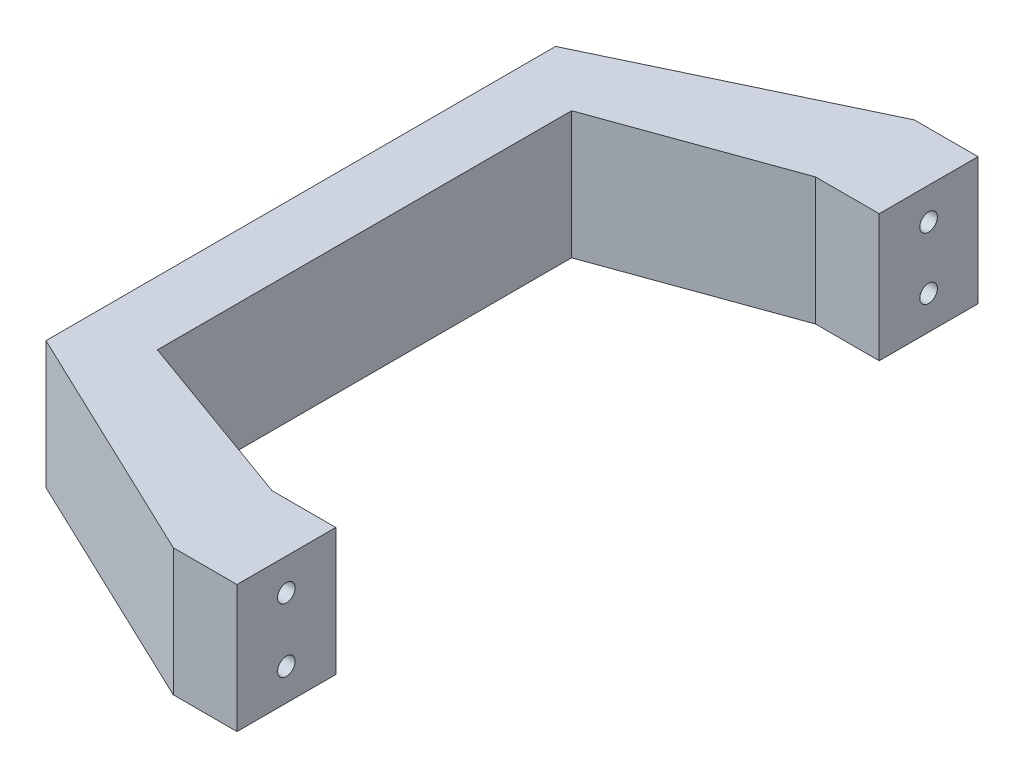
ISO-10303-21;
HEADER;
FILE_DESCRIPTION(('STEP AP214'),'2;1');
FILE_NAME('part.step','',(''),(''),'','','');
FILE_SCHEMA(('AUTOMOTIVE_DESIGN { 1 0 10303 214 1 1 1 1 }'));
ENDSEC;
DATA;
#1=APPLICATION_CONTEXT('core data for automotive mechanical design processes');
#2=APPLICATION_PROTOCOL_DEFINITION('international standard','automotive_design',2000,#1);
#3=PRODUCT_CONTEXT('',#1,'mechanical');
#4=PRODUCT('Part','Part','',(#3));
#5=PRODUCT_RELATED_PRODUCT_CATEGORY('part','',(#4));
#6=PRODUCT_DEFINITION_FORMATION('','',#4);
#7=PRODUCT_DEFINITION_CONTEXT('part definition',#1,'design');
#8=PRODUCT_DEFINITION('design','',#6,#7);
#9=PRODUCT_DEFINITION_SHAPE('','',#8);
#10=(LENGTH_UNIT() NAMED_UNIT(*) SI_UNIT(.MILLI.,.METRE.));
#11=(NAMED_UNIT(*) PLANE_ANGLE_UNIT() SI_UNIT($,.RADIAN.));
#12=(NAMED_UNIT(*) SI_UNIT($,.STERADIAN.) SOLID_ANGLE_UNIT());
#13=UNCERTAINTY_MEASURE_WITH_UNIT(LENGTH_MEASURE(1.E-05),#10,'distance_accuracy_value','');
#14=(GEOMETRIC_REPRESENTATION_CONTEXT(3) GLOBAL_UNCERTAINTY_ASSIGNED_CONTEXT((#13)) GLOBAL_UNIT_ASSIGNED_CONTEXT((#10,
#11,#12)) REPRESENTATION_CONTEXT('',''));
#15=CARTESIAN_POINT('',(0.,0.,0.));
#16=DIRECTION('',(0.,0.,1.));
#17=DIRECTION('',(1.,0.,0.));
#18=AXIS2_PLACEMENT_3D('',#15,#16,#17);
#19=CARTESIAN_POINT('',(-370.28515918275,25.4,60.7601053290348));
#20=DIRECTION('',(0.,0.,-1.));
#21=DIRECTION('',(-1.,0.,0.));
#22=AXIS2_PLACEMENT_3D('',#19,#20,#21);
#23=PLANE('',#22);
#24=DIRECTION('',(1.,0.,0.));
#25=VECTOR('',#24,1.);
#26=CARTESIAN_POINT('',(-370.28515918275,0.,60.7601053290348));
#27=LINE('',#26,#25);
#28=CARTESIAN_POINT('',(-382.98515918275,0.,60.7601053290348));
#29=VERTEX_POINT('',#28);
#30=CARTESIAN_POINT('',(-370.28515918275,0.,60.7601053290348));
#31=VERTEX_POINT('',#30);
#32=EDGE_CURVE('E156',#29,#31,#27,.T.);
#33=ORIENTED_EDGE('',*,*,#32,.T.);
#34=DIRECTION('',(0.,-1.,0.));
#35=VECTOR('',#34,1.);
#36=CARTESIAN_POINT('',(-370.28515918275,25.4,60.7601053290348));
#37=LINE('',#36,#35);
#38=CARTESIAN_POINT('',(-370.28515918275,25.4,60.7601053290348));
#39=VERTEX_POINT('',#38);
#40=EDGE_CURVE('E11',#39,#31,#37,.T.);
#41=ORIENTED_EDGE('',*,*,#40,.F.);
#42=DIRECTION('',(1.,0.,0.));
#43=VECTOR('',#42,1.);
#44=CARTESIAN_POINT('',(-370.28515918275,25.4,60.7601053290348));
#45=LINE('',#44,#43);
#46=CARTESIAN_POINT('',(-382.98515918275,25.4,60.7601053290348));
#47=VERTEX_POINT('',#46);
#48=EDGE_CURVE('E179',#47,#39,#45,.T.);
#49=ORIENTED_EDGE('',*,*,#48,.F.);
#50=DIRECTION('',(0.,-1.,0.));
#51=VECTOR('',#50,1.);
#52=CARTESIAN_POINT('',(-382.98515918275,25.4,60.7601053290348));
#53=LINE('',#52,#51);
#54=EDGE_CURVE('E152',#47,#29,#53,.T.);
#55=ORIENTED_EDGE('',*,*,#54,.T.);
#56=EDGE_LOOP('',(#33,#41,#49,#55));
#57=FACE_BOUND('',#56,.T.);
#58=ADVANCED_FACE('F36',(#57),#23,.F.);
#59=CARTESIAN_POINT('',(-370.28515918275,25.4,60.7601053290348));
#60=DIRECTION('',(-1.,0.,0.));
#61=DIRECTION('',(0.,0.,1.));
#62=AXIS2_PLACEMENT_3D('',#59,#60,#61);
#63=PLANE('',#62);
#64=CARTESIAN_POINT('',(-370.28515918275,19.05,50.912648711417));
#65=DIRECTION('',(1.,0.,0.));
#66=DIRECTION('',(0.,0.,-1.));
#67=AXIS2_PLACEMENT_3D('',#64,#65,#66);
#68=CIRCLE('',#67,1.75259999999999);
#69=CARTESIAN_POINT('',(-370.28515918275,19.05,49.160048711417));
#70=VERTEX_POINT('',#69);
#71=EDGE_CURVE('E493',#70,#70,#68,.T.);
#72=ORIENTED_EDGE('',*,*,#71,.F.);
#73=EDGE_LOOP('',(#72));
#74=FACE_BOUND('',#73,.T.);
#75=CARTESIAN_POINT('',(-370.28515918275,6.73055806956673,50.912648711417));
#76=DIRECTION('',(1.,0.,0.));
#77=DIRECTION('',(0.,0.,-1.));
#78=AXIS2_PLACEMENT_3D('',#75,#76,#77);
#79=CIRCLE('',#78,1.7526);
#80=CARTESIAN_POINT('',(-370.28515918275,6.73055806956673,49.160048711417));
#81=VERTEX_POINT('',#80);
#82=EDGE_CURVE('E515',#81,#81,#79,.T.);
#83=ORIENTED_EDGE('',*,*,#82,.F.);
#84=EDGE_LOOP('',(#83));
#85=FACE_BOUND('',#84,.T.);
#86=DIRECTION('',(0.,0.,-1.));
#87=VECTOR('',#86,1.);
#88=CARTESIAN_POINT('',(-370.28515918275,0.,60.7601053290348));
#89=LINE('',#88,#87);
#90=CARTESIAN_POINT('',(-370.28515918275,0.,41.0651920937729));
#91=VERTEX_POINT('',#90);
#92=EDGE_CURVE('E159',#31,#91,#89,.T.);
#93=ORIENTED_EDGE('',*,*,#92,.T.);
#94=DIRECTION('',(0.,-1.,0.));
#95=VECTOR('',#94,1.);
#96=CARTESIAN_POINT('',(-370.28515918275,25.4,41.0651920937729));
#97=LINE('',#96,#95);
#98=CARTESIAN_POINT('',(-370.28515918275,25.4,41.0651920937729));
#99=VERTEX_POINT('',#98);
#100=EDGE_CURVE('E44',#99,#91,#97,.T.);
#101=ORIENTED_EDGE('',*,*,#100,.F.);
#102=DIRECTION('',(0.,0.,-1.));
#103=VECTOR('',#102,1.);
#104=CARTESIAN_POINT('',(-370.28515918275,25.4,60.7601053290348));
#105=LINE('',#104,#103);
#106=EDGE_CURVE('E107',#39,#99,#105,.T.);
#107=ORIENTED_EDGE('',*,*,#106,.F.);
#108=ORIENTED_EDGE('',*,*,#40,.T.);
#109=EDGE_LOOP('',(#93,#101,#107,#108));
#110=FACE_BOUND('',#109,.T.);
#111=ADVANCED_FACE('F257',(#74,#85,#110),#63,.F.);
#112=CARTESIAN_POINT('',(-370.28515918275,25.4,41.0651920937729));
#113=DIRECTION('',(0.,0.,1.));
#114=DIRECTION('',(1.,0.,0.));
#115=AXIS2_PLACEMENT_3D('',#112,#113,#114);
#116=PLANE('',#115);
#117=DIRECTION('',(-1.,0.,0.));
#118=VECTOR('',#117,1.);
#119=CARTESIAN_POINT('',(-370.28515918275,0.,41.0651920937729));
#120=LINE('',#119,#118);
#121=CARTESIAN_POINT('',(-382.98515918275,0.,41.0651920937729));
#122=VERTEX_POINT('',#121);
#123=EDGE_CURVE('E162',#91,#122,#120,.T.);
#124=ORIENTED_EDGE('',*,*,#123,.T.);
#125=DIRECTION('',(0.,-1.,0.));
#126=VECTOR('',#125,1.);
#127=CARTESIAN_POINT('',(-382.98515918275,25.4,41.0651920937729));
#128=LINE('',#127,#126);
#129=CARTESIAN_POINT('',(-382.98515918275,25.4,41.0651920937729));
#130=VERTEX_POINT('',#129);
#131=EDGE_CURVE('E198',#130,#122,#128,.T.);
#132=ORIENTED_EDGE('',*,*,#131,.F.);
#133=DIRECTION('',(-1.,0.,0.));
#134=VECTOR('',#133,1.);
#135=CARTESIAN_POINT('',(-370.28515918275,25.4,41.0651920937729));
#136=LINE('',#135,#134);
#137=EDGE_CURVE('E206',#99,#130,#136,.T.);
#138=ORIENTED_EDGE('',*,*,#137,.F.);
#139=ORIENTED_EDGE('',*,*,#100,.T.);
#140=EDGE_LOOP('',(#124,#132,#138,#139));
#141=FACE_BOUND('',#140,.T.);
#142=ADVANCED_FACE('F204',(#141),#116,.F.);
#143=CARTESIAN_POINT('',(-382.98515918275,25.4,41.0651920937729));
#144=DIRECTION('',(0.42992476104232,0.,0.902864718461578));
#145=DIRECTION('',(0.902864718461578,0.,-0.42992476104232));
#146=AXIS2_PLACEMENT_3D('',#143,#144,#145);
#147=PLANE('',#146);
#148=DIRECTION('',(-0.902864718461578,0.,0.42992476104232));
#149=VECTOR('',#148,1.);
#150=CARTESIAN_POINT('',(-382.98515918275,0.,41.0651920937729));
#151=LINE('',#150,#149);
#152=CARTESIAN_POINT('',(-431.431729332052,0.,64.1344068596894));
#153=VERTEX_POINT('',#152);
#154=EDGE_CURVE('E164',#122,#153,#151,.T.);
#155=ORIENTED_EDGE('',*,*,#154,.T.);
#156=DIRECTION('',(0.,-1.,0.));
#157=VECTOR('',#156,1.);
#158=CARTESIAN_POINT('',(-431.431729332052,25.4,64.1344068596894));
#159=LINE('',#158,#157);
#160=CARTESIAN_POINT('',(-431.431729332052,25.4,64.1344068596894));
#161=VERTEX_POINT('',#160);
#162=EDGE_CURVE('E195',#161,#153,#159,.T.);
#163=ORIENTED_EDGE('',*,*,#162,.F.);
#164=DIRECTION('',(-0.902864718461578,0.,0.42992476104232));
#165=VECTOR('',#164,1.);
#166=CARTESIAN_POINT('',(-382.98515918275,25.4,41.0651920937729));
#167=LINE('',#166,#165);
#168=EDGE_CURVE('E224',#130,#161,#167,.T.);
#169=ORIENTED_EDGE('',*,*,#168,.F.);
#170=ORIENTED_EDGE('',*,*,#131,.T.);
#171=EDGE_LOOP('',(#155,#163,#169,#170));
#172=FACE_BOUND('',#171,.T.);
#173=ADVANCED_FACE('F215',(#172),#147,.F.);
#174=CARTESIAN_POINT('',(-431.431729332053,25.4,165.734406859689));
#175=DIRECTION('',(1.,0.,0.));
#176=DIRECTION('',(0.,0.,-1.));
#177=AXIS2_PLACEMENT_3D('',#174,#175,#176);
#178=PLANE('',#177);
#179=DIRECTION('',(0.,0.,1.));
#180=VECTOR('',#179,1.);
#181=CARTESIAN_POINT('',(-431.431729332053,0.,165.734406859689));
#182=LINE('',#181,#180);
#183=CARTESIAN_POINT('',(-431.431729332053,0.,165.734406859689));
#184=VERTEX_POINT('',#183);
#185=EDGE_CURVE('E166',#153,#184,#182,.T.);
#186=ORIENTED_EDGE('',*,*,#185,.T.);
#187=DIRECTION('',(0.,-1.,0.));
#188=VECTOR('',#187,1.);
#189=CARTESIAN_POINT('',(-431.431729332053,25.4,165.734406859689));
#190=LINE('',#189,#188);
#191=CARTESIAN_POINT('',(-431.431729332053,25.4,165.734406859689));
#192=VERTEX_POINT('',#191);
#193=EDGE_CURVE('E192',#192,#184,#190,.T.);
#194=ORIENTED_EDGE('',*,*,#193,.F.);
#195=DIRECTION('',(0.,0.,1.));
#196=VECTOR('',#195,1.);
#197=CARTESIAN_POINT('',(-431.431729332053,25.4,165.734406859689));
#198=LINE('',#197,#196);
#199=EDGE_CURVE('E221',#161,#192,#198,.T.);
#200=ORIENTED_EDGE('',*,*,#199,.F.);
#201=ORIENTED_EDGE('',*,*,#162,.T.);
#202=EDGE_LOOP('',(#186,#194,#200,#201));
#203=FACE_BOUND('',#202,.T.);
#204=ADVANCED_FACE('F219',(#203),#178,.F.);
#205=CARTESIAN_POINT('',(-382.98515918275,25.4,188.803621625606));
#206=DIRECTION('',(0.429924761042324,0.,-0.902864718461576));
#207=DIRECTION('',(-0.902864718461576,0.,-0.429924761042324));
#208=AXIS2_PLACEMENT_3D('',#205,#206,#207);
#209=PLANE('',#208);
#210=DIRECTION('',(0.902864718461576,0.,0.429924761042324));
#211=VECTOR('',#210,1.);
#212=CARTESIAN_POINT('',(-382.98515918275,0.,188.803621625606));
#213=LINE('',#212,#211);
#214=CARTESIAN_POINT('',(-382.98515918275,0.,188.803621625606));
#215=VERTEX_POINT('',#214);
#216=EDGE_CURVE('E168',#184,#215,#213,.T.);
#217=ORIENTED_EDGE('',*,*,#216,.T.);
#218=DIRECTION('',(0.,-1.,0.));
#219=VECTOR('',#218,1.);
#220=CARTESIAN_POINT('',(-382.98515918275,25.4,188.803621625606));
#221=LINE('',#220,#219);
#222=CARTESIAN_POINT('',(-382.98515918275,25.4,188.803621625606));
#223=VERTEX_POINT('',#222);
#224=EDGE_CURVE('E189',#223,#215,#221,.T.);
#225=ORIENTED_EDGE('',*,*,#224,.F.);
#226=DIRECTION('',(0.902864718461576,0.,0.429924761042324));
#227=VECTOR('',#226,1.);
#228=CARTESIAN_POINT('',(-382.98515918275,25.4,188.803621625606));
#229=LINE('',#228,#227);
#230=EDGE_CURVE('E223',#192,#223,#229,.T.);
#231=ORIENTED_EDGE('',*,*,#230,.F.);
#232=ORIENTED_EDGE('',*,*,#193,.T.);
#233=EDGE_LOOP('',(#217,#225,#231,#232));
#234=FACE_BOUND('',#233,.T.);
#235=ADVANCED_FACE('F273',(#234),#209,.F.);
#236=CARTESIAN_POINT('',(-370.28515918275,25.4,188.803621625606));
#237=DIRECTION('',(0.,0.,-1.));
#238=DIRECTION('',(-1.,0.,0.));
#239=AXIS2_PLACEMENT_3D('',#236,#237,#238);
#240=PLANE('',#239);
#241=DIRECTION('',(1.,0.,0.));
#242=VECTOR('',#241,1.);
#243=CARTESIAN_POINT('',(-370.28515918275,0.,188.803621625606));
#244=LINE('',#243,#242);
#245=CARTESIAN_POINT('',(-370.28515918275,0.,188.803621625606));
#246=VERTEX_POINT('',#245);
#247=EDGE_CURVE('E170',#215,#246,#244,.T.);
#248=ORIENTED_EDGE('',*,*,#247,.T.);
#249=DIRECTION('',(0.,-1.,0.));
#250=VECTOR('',#249,1.);
#251=CARTESIAN_POINT('',(-370.28515918275,25.4,188.803621625606));
#252=LINE('',#251,#250);
#253=CARTESIAN_POINT('',(-370.28515918275,25.4,188.803621625606));
#254=VERTEX_POINT('',#253);
#255=EDGE_CURVE('E186',#254,#246,#252,.T.);
#256=ORIENTED_EDGE('',*,*,#255,.F.);
#257=DIRECTION('',(1.,0.,0.));
#258=VECTOR('',#257,1.);
#259=CARTESIAN_POINT('',(-370.28515918275,25.4,188.803621625606));
#260=LINE('',#259,#258);
#261=EDGE_CURVE('E226',#223,#254,#260,.T.);
#262=ORIENTED_EDGE('',*,*,#261,.F.);
#263=ORIENTED_EDGE('',*,*,#224,.T.);
#264=EDGE_LOOP('',(#248,#256,#262,#263));
#265=FACE_BOUND('',#264,.T.);
#266=ADVANCED_FACE('F276',(#265),#240,.F.);
#267=CARTESIAN_POINT('',(-370.28515918275,25.4,169.108708390344));
#268=DIRECTION('',(-1.,0.,0.));
#269=DIRECTION('',(0.,0.,1.));
#270=AXIS2_PLACEMENT_3D('',#267,#268,#269);
#271=PLANE('',#270);
#272=CARTESIAN_POINT('',(-370.28515918275,6.35,178.956165007988));
#273=DIRECTION('',(1.,0.,0.));
#274=DIRECTION('',(0.,0.,-1.));
#275=AXIS2_PLACEMENT_3D('',#272,#273,#274);
#276=CIRCLE('',#275,1.75259999999998);
#277=CARTESIAN_POINT('',(-370.28515918275,6.35,177.203565007988));
#278=VERTEX_POINT('',#277);
#279=EDGE_CURVE('E505',#278,#278,#276,.T.);
#280=ORIENTED_EDGE('',*,*,#279,.F.);
#281=EDGE_LOOP('',(#280));
#282=FACE_BOUND('',#281,.T.);
#283=CARTESIAN_POINT('',(-370.28515918275,19.05,178.956165007988));
#284=DIRECTION('',(1.,0.,0.));
#285=DIRECTION('',(0.,0.,-1.));
#286=AXIS2_PLACEMENT_3D('',#283,#284,#285);
#287=CIRCLE('',#286,1.7526);
#288=CARTESIAN_POINT('',(-370.28515918275,19.05,177.203565007988));
#289=VERTEX_POINT('',#288);
#290=EDGE_CURVE('E502',#289,#289,#287,.T.);
#291=ORIENTED_EDGE('',*,*,#290,.F.);
#292=EDGE_LOOP('',(#291));
#293=FACE_BOUND('',#292,.T.);
#294=DIRECTION('',(0.,0.,-1.));
#295=VECTOR('',#294,1.);
#296=CARTESIAN_POINT('',(-370.28515918275,0.,169.108708390344));
#297=LINE('',#296,#295);
#298=CARTESIAN_POINT('',(-370.28515918275,0.,169.108708390344));
#299=VERTEX_POINT('',#298);
#300=EDGE_CURVE('E172',#246,#299,#297,.T.);
#301=ORIENTED_EDGE('',*,*,#300,.T.);
#302=DIRECTION('',(0.,-1.,0.));
#303=VECTOR('',#302,1.);
#304=CARTESIAN_POINT('',(-370.28515918275,25.4,169.108708390344));
#305=LINE('',#304,#303);
#306=CARTESIAN_POINT('',(-370.28515918275,25.4,169.108708390344));
#307=VERTEX_POINT('',#306);
#308=EDGE_CURVE('E183',#307,#299,#305,.T.);
#309=ORIENTED_EDGE('',*,*,#308,.F.);
#310=DIRECTION('',(0.,0.,-1.));
#311=VECTOR('',#310,1.);
#312=CARTESIAN_POINT('',(-370.28515918275,25.4,169.108708390344));
#313=LINE('',#312,#311);
#314=EDGE_CURVE('E232',#254,#307,#313,.T.);
#315=ORIENTED_EDGE('',*,*,#314,.F.);
#316=ORIENTED_EDGE('',*,*,#255,.T.);
#317=EDGE_LOOP('',(#301,#309,#315,#316));
#318=FACE_BOUND('',#317,.T.);
#319=ADVANCED_FACE('F238',(#282,#293,#318),#271,.F.);
#320=CARTESIAN_POINT('',(-370.28515918275,25.4,169.108708390344));
#321=DIRECTION('',(0.,0.,1.));
#322=DIRECTION('',(1.,0.,0.));
#323=AXIS2_PLACEMENT_3D('',#320,#321,#322);
#324=PLANE('',#323);
#325=DIRECTION('',(-1.,0.,0.));
#326=VECTOR('',#325,1.);
#327=CARTESIAN_POINT('',(-370.28515918275,0.,169.108708390344));
#328=LINE('',#327,#326);
#329=CARTESIAN_POINT('',(-382.98515918275,0.,169.108708390344));
#330=VERTEX_POINT('',#329);
#331=EDGE_CURVE('E174',#299,#330,#328,.T.);
#332=ORIENTED_EDGE('',*,*,#331,.T.);
#333=DIRECTION('',(0.,-1.,0.));
#334=VECTOR('',#333,1.);
#335=CARTESIAN_POINT('',(-382.98515918275,25.4,169.108708390344));
#336=LINE('',#335,#334);
#337=CARTESIAN_POINT('',(-382.98515918275,25.4,169.108708390344));
#338=VERTEX_POINT('',#337);
#339=EDGE_CURVE('E147',#338,#330,#336,.T.);
#340=ORIENTED_EDGE('',*,*,#339,.F.);
#341=DIRECTION('',(-1.,0.,0.));
#342=VECTOR('',#341,1.);
#343=CARTESIAN_POINT('',(-370.28515918275,25.4,169.108708390344));
#344=LINE('',#343,#342);
#345=EDGE_CURVE('E138',#307,#338,#344,.T.);
#346=ORIENTED_EDGE('',*,*,#345,.F.);
#347=ORIENTED_EDGE('',*,*,#308,.T.);
#348=EDGE_LOOP('',(#332,#340,#346,#347));
#349=FACE_BOUND('',#348,.T.);
#350=ADVANCED_FACE('F242',(#349),#324,.F.);
#351=CARTESIAN_POINT('',(-382.98515918275,25.4,169.108708390344));
#352=DIRECTION('',(-0.339061141307047,0.,0.940764339489738));
#353=DIRECTION('',(0.940764339489738,0.,0.339061141307047));
#354=AXIS2_PLACEMENT_3D('',#351,#352,#353);
#355=PLANE('',#354);
#356=DIRECTION('',(-0.940764339489738,0.,-0.339061141307047));
#357=VECTOR('',#356,1.);
#358=CARTESIAN_POINT('',(-382.98515918275,0.,169.108708390344));
#359=LINE('',#358,#357);
#360=CARTESIAN_POINT('',(-418.731729332053,0.,156.225276946494));
#361=VERTEX_POINT('',#360);
#362=EDGE_CURVE('E146',#330,#361,#359,.T.);
#363=ORIENTED_EDGE('',*,*,#362,.T.);
#364=DIRECTION('',(0.,-1.,0.));
#365=VECTOR('',#364,1.);
#366=CARTESIAN_POINT('',(-418.731729332053,25.4,156.225276946494));
#367=LINE('',#366,#365);
#368=CARTESIAN_POINT('',(-418.731729332053,25.4,156.225276946494));
#369=VERTEX_POINT('',#368);
#370=EDGE_CURVE('E143',#369,#361,#367,.T.);
#371=ORIENTED_EDGE('',*,*,#370,.F.);
#372=DIRECTION('',(-0.940764339489738,0.,-0.339061141307047));
#373=VECTOR('',#372,1.);
#374=CARTESIAN_POINT('',(-382.98515918275,25.4,169.108708390344));
#375=LINE('',#374,#373);
#376=EDGE_CURVE('E132',#338,#369,#375,.T.);
#377=ORIENTED_EDGE('',*,*,#376,.F.);
#378=ORIENTED_EDGE('',*,*,#339,.T.);
#379=EDGE_LOOP('',(#363,#371,#377,#378));
#380=FACE_BOUND('',#379,.T.);
#381=ADVANCED_FACE('F144',(#380),#355,.F.);
#382=CARTESIAN_POINT('',(-418.731729332052,25.4,73.6435367728847));
#383=DIRECTION('',(-1.,0.,0.));
#384=DIRECTION('',(0.,0.,1.));
#385=AXIS2_PLACEMENT_3D('',#382,#383,#384);
#386=PLANE('',#385);
#387=DIRECTION('',(0.,0.,-1.));
#388=VECTOR('',#387,1.);
#389=CARTESIAN_POINT('',(-418.731729332052,0.,73.6435367728847));
#390=LINE('',#389,#388);
#391=CARTESIAN_POINT('',(-418.731729332052,0.,73.6435367728847));
#392=VERTEX_POINT('',#391);
#393=EDGE_CURVE('E93',#361,#392,#390,.T.);
#394=ORIENTED_EDGE('',*,*,#393,.T.);
#395=DIRECTION('',(0.,-1.,0.));
#396=VECTOR('',#395,1.);
#397=CARTESIAN_POINT('',(-418.731729332052,25.4,73.6435367728847));
#398=LINE('',#397,#396);
#399=CARTESIAN_POINT('',(-418.731729332052,25.4,73.6435367728847));
#400=VERTEX_POINT('',#399);
#401=EDGE_CURVE('E148',#400,#392,#398,.T.);
#402=ORIENTED_EDGE('',*,*,#401,.F.);
#403=DIRECTION('',(0.,0.,-1.));
#404=VECTOR('',#403,1.);
#405=CARTESIAN_POINT('',(-418.731729332052,25.4,73.6435367728847));
#406=LINE('',#405,#404);
#407=EDGE_CURVE('E136',#369,#400,#406,.T.);
#408=ORIENTED_EDGE('',*,*,#407,.F.);
#409=ORIENTED_EDGE('',*,*,#370,.T.);
#410=EDGE_LOOP('',(#394,#402,#408,#409));
#411=FACE_BOUND('',#410,.T.);
#412=ADVANCED_FACE('F150',(#411),#386,.F.);
#413=CARTESIAN_POINT('',(-382.98515918275,25.4,60.7601053290348));
#414=DIRECTION('',(-0.339061141307042,0.,-0.94076433948974));
#415=DIRECTION('',(-0.94076433948974,0.,0.339061141307042));
#416=AXIS2_PLACEMENT_3D('',#413,#414,#415);
#417=PLANE('',#416);
#418=DIRECTION('',(0.94076433948974,0.,-0.339061141307042));
#419=VECTOR('',#418,1.);
#420=CARTESIAN_POINT('',(-382.98515918275,0.,60.7601053290348));
#421=LINE('',#420,#419);
#422=EDGE_CURVE('E99',#392,#29,#421,.T.);
#423=ORIENTED_EDGE('',*,*,#422,.T.);
#424=ORIENTED_EDGE('',*,*,#54,.F.);
#425=DIRECTION('',(0.94076433948974,0.,-0.339061141307042));
#426=VECTOR('',#425,1.);
#427=CARTESIAN_POINT('',(-382.98515918275,25.4,60.7601053290348));
#428=LINE('',#427,#426);
#429=EDGE_CURVE('E52',#400,#47,#428,.T.);
#430=ORIENTED_EDGE('',*,*,#429,.F.);
#431=ORIENTED_EDGE('',*,*,#401,.T.);
#432=EDGE_LOOP('',(#423,#424,#430,#431));
#433=FACE_BOUND('',#432,.T.);
#434=ADVANCED_FACE('F246',(#433),#417,.F.);
#435=CARTESIAN_POINT('',(0.,25.4,0.));
#436=DIRECTION('',(0.,1.,0.));
#437=DIRECTION('',(0.,0.,1.));
#438=AXIS2_PLACEMENT_3D('',#435,#436,#437);
#439=PLANE('',#438);
#440=ORIENTED_EDGE('',*,*,#48,.T.);
#441=ORIENTED_EDGE('',*,*,#106,.T.);
#442=ORIENTED_EDGE('',*,*,#137,.T.);
#443=ORIENTED_EDGE('',*,*,#168,.T.);
#444=ORIENTED_EDGE('',*,*,#199,.T.);
#445=ORIENTED_EDGE('',*,*,#230,.T.);
#446=ORIENTED_EDGE('',*,*,#261,.T.);
#447=ORIENTED_EDGE('',*,*,#314,.T.);
#448=ORIENTED_EDGE('',*,*,#345,.T.);
#449=ORIENTED_EDGE('',*,*,#376,.T.);
#450=ORIENTED_EDGE('',*,*,#407,.T.);
#451=ORIENTED_EDGE('',*,*,#429,.T.);
#452=EDGE_LOOP('',(#440,#441,#442,#443,#444,#445,#446,#447,#448,#449,#450,#451));
#453=FACE_BOUND('',#452,.T.);
#454=ADVANCED_FACE('F134',(#453),#439,.T.);
#455=CARTESIAN_POINT('',(0.,0.,0.));
#456=DIRECTION('',(0.,1.,0.));
#457=DIRECTION('',(0.,0.,1.));
#458=AXIS2_PLACEMENT_3D('',#455,#456,#457);
#459=PLANE('',#458);
#460=ORIENTED_EDGE('',*,*,#32,.F.);
#461=ORIENTED_EDGE('',*,*,#422,.F.);
#462=ORIENTED_EDGE('',*,*,#393,.F.);
#463=ORIENTED_EDGE('',*,*,#362,.F.);
#464=ORIENTED_EDGE('',*,*,#331,.F.);
#465=ORIENTED_EDGE('',*,*,#300,.F.);
#466=ORIENTED_EDGE('',*,*,#247,.F.);
#467=ORIENTED_EDGE('',*,*,#216,.F.);
#468=ORIENTED_EDGE('',*,*,#185,.F.);
#469=ORIENTED_EDGE('',*,*,#154,.F.);
#470=ORIENTED_EDGE('',*,*,#123,.F.);
#471=ORIENTED_EDGE('',*,*,#92,.F.);
#472=EDGE_LOOP('',(#460,#461,#462,#463,#464,#465,#466,#467,#468,#469,#470,#471));
#473=FACE_BOUND('',#472,.T.);
#474=ADVANCED_FACE('F210',(#473),#459,.F.);
#475=CARTESIAN_POINT('',(-382.98515918275,19.05,178.956165007988));
#476=DIRECTION('',(1.,0.,0.));
#477=DIRECTION('',(0.,0.,-1.));
#478=AXIS2_PLACEMENT_3D('',#475,#476,#477);
#479=CYLINDRICAL_SURFACE('',#478,1.7526);
#480=CARTESIAN_POINT('',(-382.98515918275,19.05,178.956165007988));
#481=DIRECTION('',(1.,0.,0.));
#482=DIRECTION('',(0.,0.,-1.));
#483=AXIS2_PLACEMENT_3D('',#480,#481,#482);
#484=CIRCLE('',#483,1.7526);
#485=CARTESIAN_POINT('',(-382.98515918275,19.05,177.203565007988));
#486=VERTEX_POINT('',#485);
#487=EDGE_CURVE('E160',#486,#486,#484,.T.);
#488=ORIENTED_EDGE('',*,*,#487,.F.);
#489=EDGE_LOOP('',(#488));
#490=FACE_BOUND('',#489,.T.);
#491=ORIENTED_EDGE('',*,*,#290,.T.);
#492=EDGE_LOOP('',(#491));
#493=FACE_BOUND('',#492,.T.);
#494=ADVANCED_FACE('F316',(#490,#493),#479,.F.);
#495=CARTESIAN_POINT('',(-382.98515918275,19.05,178.956165007988));
#496=DIRECTION('',(1.,0.,0.));
#497=DIRECTION('',(0.,0.,-1.));
#498=AXIS2_PLACEMENT_3D('',#495,#496,#497);
#499=PLANE('',#498);
#500=ORIENTED_EDGE('',*,*,#487,.T.);
#501=EDGE_LOOP('',(#500));
#502=FACE_BOUND('',#501,.T.);
#503=ADVANCED_FACE('F342',(#502),#499,.T.);
#504=CARTESIAN_POINT('',(-382.98515918275,6.35,178.956165007988));
#505=DIRECTION('',(1.,0.,0.));
#506=DIRECTION('',(0.,0.,-1.));
#507=AXIS2_PLACEMENT_3D('',#504,#505,#506);
#508=CYLINDRICAL_SURFACE('',#507,1.75259999999998);
#509=CARTESIAN_POINT('',(-382.98515918275,6.35,178.956165007988));
#510=DIRECTION('',(1.,0.,0.));
#511=DIRECTION('',(0.,0.,-1.));
#512=AXIS2_PLACEMENT_3D('',#509,#510,#511);
#513=CIRCLE('',#512,1.75259999999998);
#514=CARTESIAN_POINT('',(-382.98515918275,6.35,177.203565007988));
#515=VERTEX_POINT('',#514);
#516=EDGE_CURVE('E510',#515,#515,#513,.T.);
#517=ORIENTED_EDGE('',*,*,#516,.F.);
#518=EDGE_LOOP('',(#517));
#519=FACE_BOUND('',#518,.T.);
#520=ORIENTED_EDGE('',*,*,#279,.T.);
#521=EDGE_LOOP('',(#520));
#522=FACE_BOUND('',#521,.T.);
#523=ADVANCED_FACE('F353',(#519,#522),#508,.F.);
#524=CARTESIAN_POINT('',(-382.98515918275,6.35,178.956165007988));
#525=DIRECTION('',(1.,0.,0.));
#526=DIRECTION('',(0.,0.,-1.));
#527=AXIS2_PLACEMENT_3D('',#524,#525,#526);
#528=PLANE('',#527);
#529=ORIENTED_EDGE('',*,*,#516,.T.);
#530=EDGE_LOOP('',(#529));
#531=FACE_BOUND('',#530,.T.);
#532=ADVANCED_FACE('F364',(#531),#528,.T.);
#533=CARTESIAN_POINT('',(-382.98515918275,6.73055806956673,50.9126487114169));
#534=DIRECTION('',(1.,0.,0.));
#535=DIRECTION('',(0.,0.,-1.));
#536=AXIS2_PLACEMENT_3D('',#533,#534,#535);
#537=CYLINDRICAL_SURFACE('',#536,1.7526);
#538=CARTESIAN_POINT('',(-382.98515918275,6.73055806956673,50.9126487114169));
#539=DIRECTION('',(1.,0.,0.));
#540=DIRECTION('',(0.,0.,-1.));
#541=AXIS2_PLACEMENT_3D('',#538,#539,#540);
#542=CIRCLE('',#541,1.7526);
#543=CARTESIAN_POINT('',(-382.98515918275,6.73055806956673,49.1600487114169));
#544=VERTEX_POINT('',#543);
#545=EDGE_CURVE('E496',#544,#544,#542,.T.);
#546=ORIENTED_EDGE('',*,*,#545,.F.);
#547=EDGE_LOOP('',(#546));
#548=FACE_BOUND('',#547,.T.);
#549=ORIENTED_EDGE('',*,*,#82,.T.);
#550=EDGE_LOOP('',(#549));
#551=FACE_BOUND('',#550,.T.);
#552=ADVANCED_FACE('F375',(#548,#551),#537,.F.);
#553=CARTESIAN_POINT('',(-382.98515918275,6.73055806956673,50.9126487114169));
#554=DIRECTION('',(1.,0.,0.));
#555=DIRECTION('',(0.,0.,-1.));
#556=AXIS2_PLACEMENT_3D('',#553,#554,#555);
#557=PLANE('',#556);
#558=ORIENTED_EDGE('',*,*,#545,.T.);
#559=EDGE_LOOP('',(#558));
#560=FACE_BOUND('',#559,.T.);
#561=ADVANCED_FACE('F386',(#560),#557,.T.);
#562=CARTESIAN_POINT('',(-382.98515918275,19.05,50.9126487114169));
#563=DIRECTION('',(1.,0.,0.));
#564=DIRECTION('',(0.,0.,-1.));
#565=AXIS2_PLACEMENT_3D('',#562,#563,#564);
#566=CYLINDRICAL_SURFACE('',#565,1.75259999999999);
#567=CARTESIAN_POINT('',(-382.98515918275,19.05,50.9126487114169));
#568=DIRECTION('',(1.,0.,0.));
#569=DIRECTION('',(0.,0.,-1.));
#570=AXIS2_PLACEMENT_3D('',#567,#568,#569);
#571=CIRCLE('',#570,1.75259999999999);
#572=CARTESIAN_POINT('',(-382.98515918275,19.05,49.1600487114169));
#573=VERTEX_POINT('',#572);
#574=EDGE_CURVE('E492',#573,#573,#571,.T.);
#575=ORIENTED_EDGE('',*,*,#574,.F.);
#576=EDGE_LOOP('',(#575));
#577=FACE_BOUND('',#576,.T.);
#578=ORIENTED_EDGE('',*,*,#71,.T.);
#579=EDGE_LOOP('',(#578));
#580=FACE_BOUND('',#579,.T.);
#581=ADVANCED_FACE('F397',(#577,#580),#566,.F.);
#582=CARTESIAN_POINT('',(-382.98515918275,19.05,50.9126487114169));
#583=DIRECTION('',(1.,0.,0.));
#584=DIRECTION('',(0.,0.,-1.));
#585=AXIS2_PLACEMENT_3D('',#582,#583,#584);
#586=PLANE('',#585);
#587=ORIENTED_EDGE('',*,*,#574,.T.);
#588=EDGE_LOOP('',(#587));
#589=FACE_BOUND('',#588,.T.);
#590=ADVANCED_FACE('F408',(#589),#586,.T.);
#591=CLOSED_SHELL('',(#58,#111,#142,#173,#204,#235,#266,#319,#350,#381,#412,#434,#454,#474,#494,
#503,#523,#532,#552,#561,#581,#590));
#592=MANIFOLD_SOLID_BREP('B2',#591);
#593=ADVANCED_BREP_SHAPE_REPRESENTATION('',(#18,#592),#14);
#594=SHAPE_DEFINITION_REPRESENTATION(#9,#593);
ENDSEC;
END-ISO-10303-21;
